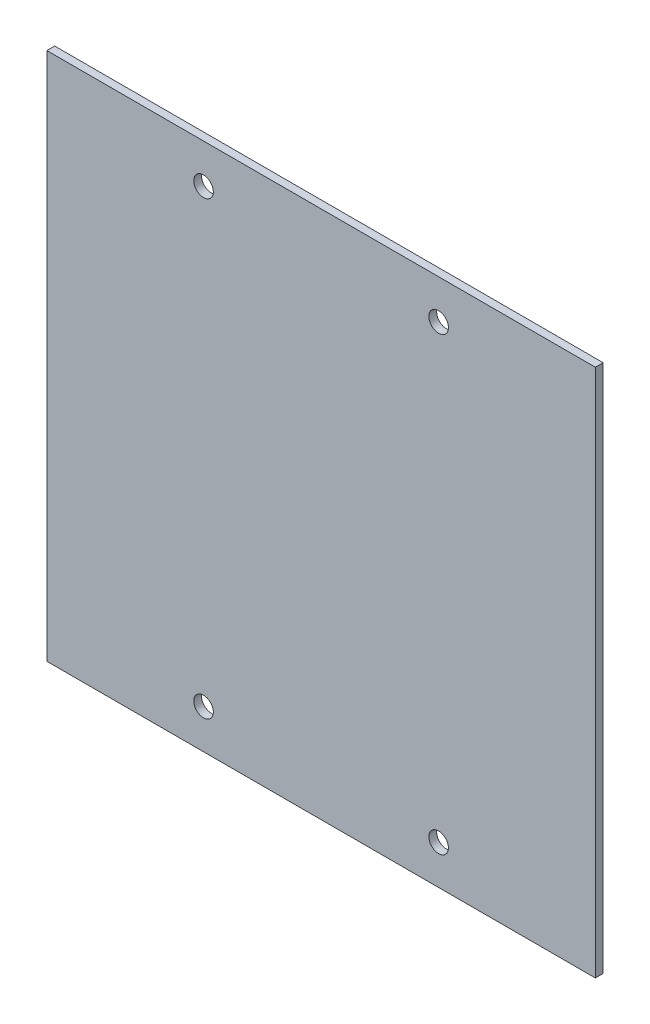
ISO-10303-21;
HEADER;
FILE_DESCRIPTION(('STEP AP214'),'2;1');
FILE_NAME('part.step','',(''),(''),'','','');
FILE_SCHEMA(('AUTOMOTIVE_DESIGN { 1 0 10303 214 1 1 1 1 }'));
ENDSEC;
DATA;
#1=APPLICATION_CONTEXT('core data for automotive mechanical design processes');
#2=APPLICATION_PROTOCOL_DEFINITION('international standard','automotive_design',2000,#1);
#3=PRODUCT_CONTEXT('',#1,'mechanical');
#4=PRODUCT('Part','Part','',(#3));
#5=PRODUCT_RELATED_PRODUCT_CATEGORY('part','',(#4));
#6=PRODUCT_DEFINITION_FORMATION('','',#4);
#7=PRODUCT_DEFINITION_CONTEXT('part definition',#1,'design');
#8=PRODUCT_DEFINITION('design','',#6,#7);
#9=PRODUCT_DEFINITION_SHAPE('','',#8);
#10=(LENGTH_UNIT() NAMED_UNIT(*) SI_UNIT(.MILLI.,.METRE.));
#11=(NAMED_UNIT(*) PLANE_ANGLE_UNIT() SI_UNIT($,.RADIAN.));
#12=(NAMED_UNIT(*) SI_UNIT($,.STERADIAN.) SOLID_ANGLE_UNIT());
#13=UNCERTAINTY_MEASURE_WITH_UNIT(LENGTH_MEASURE(1.E-05),#10,'distance_accuracy_value','');
#14=(GEOMETRIC_REPRESENTATION_CONTEXT(3) GLOBAL_UNCERTAINTY_ASSIGNED_CONTEXT((#13)) GLOBAL_UNIT_ASSIGNED_CONTEXT((#10,
#11,#12)) REPRESENTATION_CONTEXT('',''));
#15=CARTESIAN_POINT('',(0.,0.,0.));
#16=DIRECTION('',(0.,0.,1.));
#17=DIRECTION('',(1.,0.,0.));
#18=AXIS2_PLACEMENT_3D('',#15,#16,#17);
#19=CARTESIAN_POINT('',(0.,0.,2.));
#20=DIRECTION('',(0.,0.,-1.));
#21=DIRECTION('',(-1.,0.,0.));
#22=AXIS2_PLACEMENT_3D('',#19,#20,#21);
#23=PLANE('',#22);
#24=DIRECTION('',(0.,-1.,0.));
#25=VECTOR('',#24,1.);
#26=CARTESIAN_POINT('',(0.,0.,2.));
#27=LINE('',#26,#25);
#28=CARTESIAN_POINT('',(0.,135.,2.));
#29=VERTEX_POINT('',#28);
#30=CARTESIAN_POINT('',(0.,0.,2.));
#31=VERTEX_POINT('',#30);
#32=EDGE_CURVE('E88',#29,#31,#27,.T.);
#33=ORIENTED_EDGE('',*,*,#32,.T.);
#34=DIRECTION('',(1.,0.,0.));
#35=VECTOR('',#34,1.);
#36=CARTESIAN_POINT('',(0.,0.,2.));
#37=LINE('',#36,#35);
#38=CARTESIAN_POINT('',(140.,0.,2.));
#39=VERTEX_POINT('',#38);
#40=EDGE_CURVE('E83',#31,#39,#37,.T.);
#41=ORIENTED_EDGE('',*,*,#40,.T.);
#42=DIRECTION('',(0.,1.,0.));
#43=VECTOR('',#42,1.);
#44=CARTESIAN_POINT('',(140.,0.,2.));
#45=LINE('',#44,#43);
#46=CARTESIAN_POINT('',(140.,135.,2.));
#47=VERTEX_POINT('',#46);
#48=EDGE_CURVE('E86',#39,#47,#45,.T.);
#49=ORIENTED_EDGE('',*,*,#48,.T.);
#50=DIRECTION('',(-1.,0.,0.));
#51=VECTOR('',#50,1.);
#52=CARTESIAN_POINT('',(0.,135.,2.));
#53=LINE('',#52,#51);
#54=EDGE_CURVE('E53',#47,#29,#53,.T.);
#55=ORIENTED_EDGE('',*,*,#54,.T.);
#56=EDGE_LOOP('',(#33,#41,#49,#55));
#57=FACE_BOUND('',#56,.T.);
#58=CARTESIAN_POINT('',(40.,125.,2.));
#59=DIRECTION('',(0.,0.,1.));
#60=DIRECTION('',(1.,0.,0.));
#61=AXIS2_PLACEMENT_3D('',#58,#59,#60);
#62=CIRCLE('',#61,2.5);
#63=CARTESIAN_POINT('',(42.5,125.,2.));
#64=VERTEX_POINT('',#63);
#65=EDGE_CURVE('E103',#64,#64,#62,.T.);
#66=ORIENTED_EDGE('',*,*,#65,.F.);
#67=EDGE_LOOP('',(#66));
#68=FACE_BOUND('',#67,.T.);
#69=CARTESIAN_POINT('',(100.,125.,2.));
#70=DIRECTION('',(0.,0.,1.));
#71=DIRECTION('',(1.,0.,0.));
#72=AXIS2_PLACEMENT_3D('',#69,#70,#71);
#73=CIRCLE('',#72,2.5);
#74=CARTESIAN_POINT('',(102.5,125.,2.));
#75=VERTEX_POINT('',#74);
#76=EDGE_CURVE('E118',#75,#75,#73,.T.);
#77=ORIENTED_EDGE('',*,*,#76,.F.);
#78=EDGE_LOOP('',(#77));
#79=FACE_BOUND('',#78,.T.);
#80=CARTESIAN_POINT('',(40.,10.,2.));
#81=DIRECTION('',(0.,0.,1.));
#82=DIRECTION('',(1.,0.,0.));
#83=AXIS2_PLACEMENT_3D('',#80,#81,#82);
#84=CIRCLE('',#83,2.5);
#85=CARTESIAN_POINT('',(42.5,10.,2.));
#86=VERTEX_POINT('',#85);
#87=EDGE_CURVE('E124',#86,#86,#84,.T.);
#88=ORIENTED_EDGE('',*,*,#87,.F.);
#89=EDGE_LOOP('',(#88));
#90=FACE_BOUND('',#89,.T.);
#91=CARTESIAN_POINT('',(100.,10.,2.));
#92=DIRECTION('',(0.,0.,1.));
#93=DIRECTION('',(1.,0.,0.));
#94=AXIS2_PLACEMENT_3D('',#91,#92,#93);
#95=CIRCLE('',#94,2.49999999999999);
#96=CARTESIAN_POINT('',(102.5,10.,2.));
#97=VERTEX_POINT('',#96);
#98=EDGE_CURVE('E130',#97,#97,#95,.T.);
#99=ORIENTED_EDGE('',*,*,#98,.F.);
#100=EDGE_LOOP('',(#99));
#101=FACE_BOUND('',#100,.T.);
#102=ADVANCED_FACE('F36',(#57,#68,#79,#90,#101),#23,.F.);
#103=CARTESIAN_POINT('',(0.,0.,0.));
#104=DIRECTION('',(0.,0.,-1.));
#105=DIRECTION('',(-1.,0.,0.));
#106=AXIS2_PLACEMENT_3D('',#103,#104,#105);
#107=PLANE('',#106);
#108=CARTESIAN_POINT('',(40.,10.,0.));
#109=DIRECTION('',(0.,0.,1.));
#110=DIRECTION('',(1.,0.,0.));
#111=AXIS2_PLACEMENT_3D('',#108,#109,#110);
#112=CIRCLE('',#111,2.5);
#113=CARTESIAN_POINT('',(42.5,10.,0.));
#114=VERTEX_POINT('',#113);
#115=EDGE_CURVE('E127',#114,#114,#112,.T.);
#116=ORIENTED_EDGE('',*,*,#115,.T.);
#117=EDGE_LOOP('',(#116));
#118=FACE_BOUND('',#117,.T.);
#119=CARTESIAN_POINT('',(40.,125.,0.));
#120=DIRECTION('',(0.,0.,1.));
#121=DIRECTION('',(1.,0.,0.));
#122=AXIS2_PLACEMENT_3D('',#119,#120,#121);
#123=CIRCLE('',#122,2.5);
#124=CARTESIAN_POINT('',(42.5,125.,0.));
#125=VERTEX_POINT('',#124);
#126=EDGE_CURVE('E115',#125,#125,#123,.T.);
#127=ORIENTED_EDGE('',*,*,#126,.T.);
#128=EDGE_LOOP('',(#127));
#129=FACE_BOUND('',#128,.T.);
#130=DIRECTION('',(0.,-1.,0.));
#131=VECTOR('',#130,1.);
#132=CARTESIAN_POINT('',(0.,0.,0.));
#133=LINE('',#132,#131);
#134=CARTESIAN_POINT('',(0.,135.,0.));
#135=VERTEX_POINT('',#134);
#136=CARTESIAN_POINT('',(0.,0.,0.));
#137=VERTEX_POINT('',#136);
#138=EDGE_CURVE('E100',#135,#137,#133,.T.);
#139=ORIENTED_EDGE('',*,*,#138,.F.);
#140=DIRECTION('',(-1.,0.,0.));
#141=VECTOR('',#140,1.);
#142=CARTESIAN_POINT('',(0.,135.,0.));
#143=LINE('',#142,#141);
#144=CARTESIAN_POINT('',(140.,135.,0.));
#145=VERTEX_POINT('',#144);
#146=EDGE_CURVE('E76',#145,#135,#143,.T.);
#147=ORIENTED_EDGE('',*,*,#146,.F.);
#148=DIRECTION('',(0.,1.,0.));
#149=VECTOR('',#148,1.);
#150=CARTESIAN_POINT('',(140.,0.,0.));
#151=LINE('',#150,#149);
#152=CARTESIAN_POINT('',(140.,0.,0.));
#153=VERTEX_POINT('',#152);
#154=EDGE_CURVE('E70',#153,#145,#151,.T.);
#155=ORIENTED_EDGE('',*,*,#154,.F.);
#156=DIRECTION('',(1.,0.,0.));
#157=VECTOR('',#156,1.);
#158=CARTESIAN_POINT('',(0.,0.,0.));
#159=LINE('',#158,#157);
#160=EDGE_CURVE('E92',#137,#153,#159,.T.);
#161=ORIENTED_EDGE('',*,*,#160,.F.);
#162=EDGE_LOOP('',(#139,#147,#155,#161));
#163=FACE_BOUND('',#162,.T.);
#164=CARTESIAN_POINT('',(100.,125.,0.));
#165=DIRECTION('',(0.,0.,1.));
#166=DIRECTION('',(1.,0.,0.));
#167=AXIS2_PLACEMENT_3D('',#164,#165,#166);
#168=CIRCLE('',#167,2.5);
#169=CARTESIAN_POINT('',(102.5,125.,0.));
#170=VERTEX_POINT('',#169);
#171=EDGE_CURVE('E121',#170,#170,#168,.T.);
#172=ORIENTED_EDGE('',*,*,#171,.T.);
#173=EDGE_LOOP('',(#172));
#174=FACE_BOUND('',#173,.T.);
#175=CARTESIAN_POINT('',(100.,10.,0.));
#176=DIRECTION('',(0.,0.,1.));
#177=DIRECTION('',(1.,0.,0.));
#178=AXIS2_PLACEMENT_3D('',#175,#176,#177);
#179=CIRCLE('',#178,2.49999999999999);
#180=CARTESIAN_POINT('',(102.5,10.,0.));
#181=VERTEX_POINT('',#180);
#182=EDGE_CURVE('E133',#181,#181,#179,.T.);
#183=ORIENTED_EDGE('',*,*,#182,.T.);
#184=EDGE_LOOP('',(#183));
#185=FACE_BOUND('',#184,.T.);
#186=ADVANCED_FACE('F111',(#118,#129,#163,#174,#185),#107,.T.);
#187=CARTESIAN_POINT('',(0.,0.,2.));
#188=DIRECTION('',(1.,0.,0.));
#189=DIRECTION('',(0.,0.,-1.));
#190=AXIS2_PLACEMENT_3D('',#187,#188,#189);
#191=PLANE('',#190);
#192=ORIENTED_EDGE('',*,*,#138,.T.);
#193=DIRECTION('',(0.,0.,-1.));
#194=VECTOR('',#193,1.);
#195=CARTESIAN_POINT('',(0.,0.,2.));
#196=LINE('',#195,#194);
#197=EDGE_CURVE('E11',#31,#137,#196,.T.);
#198=ORIENTED_EDGE('',*,*,#197,.F.);
#199=ORIENTED_EDGE('',*,*,#32,.F.);
#200=DIRECTION('',(0.,0.,-1.));
#201=VECTOR('',#200,1.);
#202=CARTESIAN_POINT('',(0.,135.,2.));
#203=LINE('',#202,#201);
#204=EDGE_CURVE('E96',#29,#135,#203,.T.);
#205=ORIENTED_EDGE('',*,*,#204,.T.);
#206=EDGE_LOOP('',(#192,#198,#199,#205));
#207=FACE_BOUND('',#206,.T.);
#208=ADVANCED_FACE('F38',(#207),#191,.F.);
#209=CARTESIAN_POINT('',(0.,0.,2.));
#210=DIRECTION('',(0.,1.,0.));
#211=DIRECTION('',(0.,0.,1.));
#212=AXIS2_PLACEMENT_3D('',#209,#210,#211);
#213=PLANE('',#212);
#214=ORIENTED_EDGE('',*,*,#160,.T.);
#215=DIRECTION('',(0.,0.,-1.));
#216=VECTOR('',#215,1.);
#217=CARTESIAN_POINT('',(140.,0.,2.));
#218=LINE('',#217,#216);
#219=EDGE_CURVE('E45',#39,#153,#218,.T.);
#220=ORIENTED_EDGE('',*,*,#219,.F.);
#221=ORIENTED_EDGE('',*,*,#40,.F.);
#222=ORIENTED_EDGE('',*,*,#197,.T.);
#223=EDGE_LOOP('',(#214,#220,#221,#222));
#224=FACE_BOUND('',#223,.T.);
#225=ADVANCED_FACE('F91',(#224),#213,.F.);
#226=CARTESIAN_POINT('',(140.,0.,2.));
#227=DIRECTION('',(-1.,0.,0.));
#228=DIRECTION('',(0.,0.,1.));
#229=AXIS2_PLACEMENT_3D('',#226,#227,#228);
#230=PLANE('',#229);
#231=ORIENTED_EDGE('',*,*,#154,.T.);
#232=DIRECTION('',(0.,0.,-1.));
#233=VECTOR('',#232,1.);
#234=CARTESIAN_POINT('',(140.,135.,2.));
#235=LINE('',#234,#233);
#236=EDGE_CURVE('E93',#47,#145,#235,.T.);
#237=ORIENTED_EDGE('',*,*,#236,.F.);
#238=ORIENTED_EDGE('',*,*,#48,.F.);
#239=ORIENTED_EDGE('',*,*,#219,.T.);
#240=EDGE_LOOP('',(#231,#237,#238,#239));
#241=FACE_BOUND('',#240,.T.);
#242=ADVANCED_FACE('F94',(#241),#230,.F.);
#243=CARTESIAN_POINT('',(0.,135.,2.));
#244=DIRECTION('',(0.,-1.,0.));
#245=DIRECTION('',(0.,0.,-1.));
#246=AXIS2_PLACEMENT_3D('',#243,#244,#245);
#247=PLANE('',#246);
#248=ORIENTED_EDGE('',*,*,#146,.T.);
#249=ORIENTED_EDGE('',*,*,#204,.F.);
#250=ORIENTED_EDGE('',*,*,#54,.F.);
#251=ORIENTED_EDGE('',*,*,#236,.T.);
#252=EDGE_LOOP('',(#248,#249,#250,#251));
#253=FACE_BOUND('',#252,.T.);
#254=ADVANCED_FACE('F108',(#253),#247,.F.);
#255=CARTESIAN_POINT('',(40.,125.,2.));
#256=DIRECTION('',(0.,0.,-1.));
#257=DIRECTION('',(-1.,0.,0.));
#258=AXIS2_PLACEMENT_3D('',#255,#256,#257);
#259=CYLINDRICAL_SURFACE('',#258,2.5);
#260=ORIENTED_EDGE('',*,*,#65,.T.);
#261=EDGE_LOOP('',(#260));
#262=FACE_BOUND('',#261,.T.);
#263=ORIENTED_EDGE('',*,*,#126,.F.);
#264=EDGE_LOOP('',(#263));
#265=FACE_BOUND('',#264,.T.);
#266=ADVANCED_FACE('F150',(#262,#265),#259,.F.);
#267=CARTESIAN_POINT('',(100.,125.,2.));
#268=DIRECTION('',(0.,0.,-1.));
#269=DIRECTION('',(-1.,0.,0.));
#270=AXIS2_PLACEMENT_3D('',#267,#268,#269);
#271=CYLINDRICAL_SURFACE('',#270,2.5);
#272=ORIENTED_EDGE('',*,*,#76,.T.);
#273=EDGE_LOOP('',(#272));
#274=FACE_BOUND('',#273,.T.);
#275=ORIENTED_EDGE('',*,*,#171,.F.);
#276=EDGE_LOOP('',(#275));
#277=FACE_BOUND('',#276,.T.);
#278=ADVANCED_FACE('F196',(#274,#277),#271,.F.);
#279=CARTESIAN_POINT('',(40.,10.,2.));
#280=DIRECTION('',(0.,0.,-1.));
#281=DIRECTION('',(-1.,0.,0.));
#282=AXIS2_PLACEMENT_3D('',#279,#280,#281);
#283=CYLINDRICAL_SURFACE('',#282,2.5);
#284=ORIENTED_EDGE('',*,*,#87,.T.);
#285=EDGE_LOOP('',(#284));
#286=FACE_BOUND('',#285,.T.);
#287=ORIENTED_EDGE('',*,*,#115,.F.);
#288=EDGE_LOOP('',(#287));
#289=FACE_BOUND('',#288,.T.);
#290=ADVANCED_FACE('F204',(#286,#289),#283,.F.);
#291=CARTESIAN_POINT('',(100.,10.,2.));
#292=DIRECTION('',(0.,0.,-1.));
#293=DIRECTION('',(-1.,0.,0.));
#294=AXIS2_PLACEMENT_3D('',#291,#292,#293);
#295=CYLINDRICAL_SURFACE('',#294,2.49999999999999);
#296=ORIENTED_EDGE('',*,*,#98,.T.);
#297=EDGE_LOOP('',(#296));
#298=FACE_BOUND('',#297,.T.);
#299=ORIENTED_EDGE('',*,*,#182,.F.);
#300=EDGE_LOOP('',(#299));
#301=FACE_BOUND('',#300,.T.);
#302=ADVANCED_FACE('F139',(#298,#301),#295,.F.);
#303=CLOSED_SHELL('',(#102,#186,#208,#225,#242,#254,#266,#278,#290,#302));
#304=MANIFOLD_SOLID_BREP('B2',#303);
#305=ADVANCED_BREP_SHAPE_REPRESENTATION('',(#18,#304),#14);
#306=SHAPE_DEFINITION_REPRESENTATION(#9,#305);
ENDSEC;
END-ISO-10303-21;
